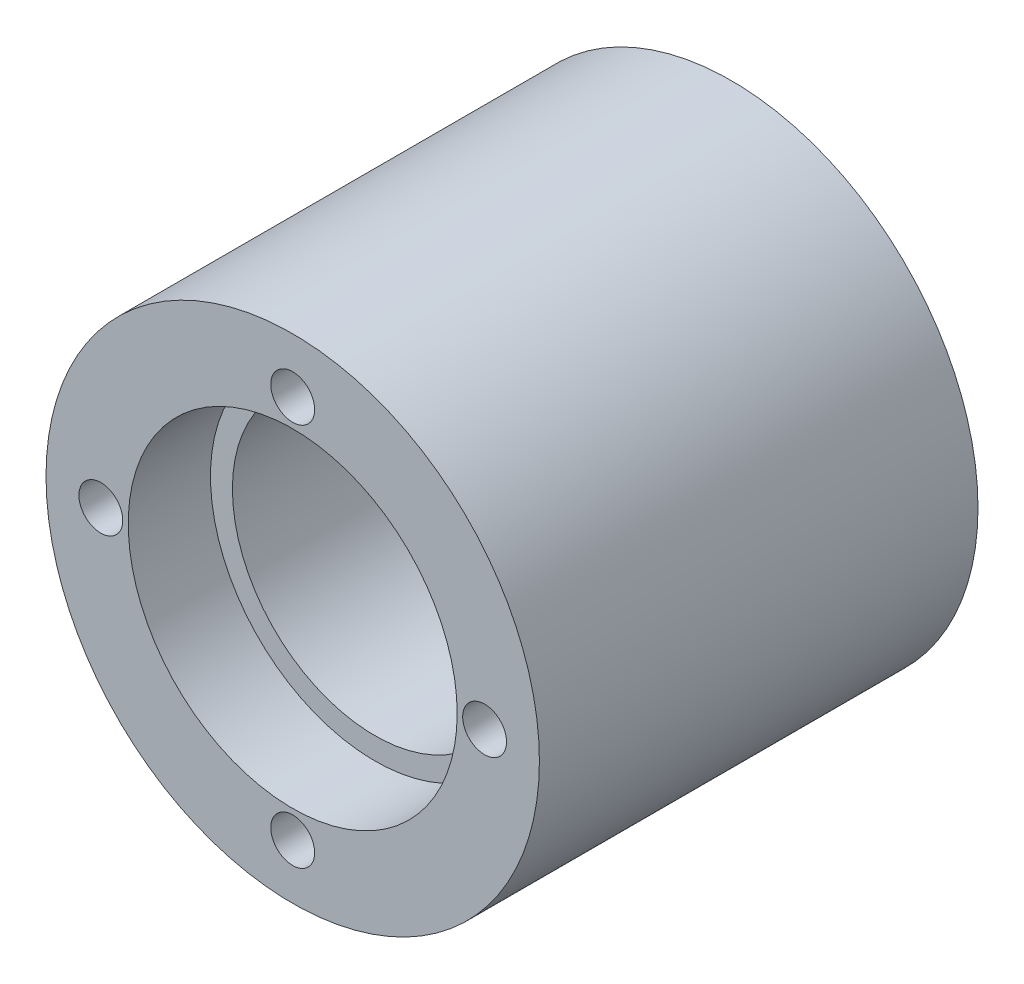
ISO-10303-21;
HEADER;
FILE_DESCRIPTION(('STEP AP214'),'2;1');
FILE_NAME('part.step','',(''),(''),'','','');
FILE_SCHEMA(('AUTOMOTIVE_DESIGN { 1 0 10303 214 1 1 1 1 }'));
ENDSEC;
DATA;
#1=APPLICATION_CONTEXT('core data for automotive mechanical design processes');
#2=APPLICATION_PROTOCOL_DEFINITION('international standard','automotive_design',2000,#1);
#3=PRODUCT_CONTEXT('',#1,'mechanical');
#4=PRODUCT('Part','Part','',(#3));
#5=PRODUCT_RELATED_PRODUCT_CATEGORY('part','',(#4));
#6=PRODUCT_DEFINITION_FORMATION('','',#4);
#7=PRODUCT_DEFINITION_CONTEXT('part definition',#1,'design');
#8=PRODUCT_DEFINITION('design','',#6,#7);
#9=PRODUCT_DEFINITION_SHAPE('','',#8);
#10=(LENGTH_UNIT() NAMED_UNIT(*) SI_UNIT(.MILLI.,.METRE.));
#11=(NAMED_UNIT(*) PLANE_ANGLE_UNIT() SI_UNIT($,.RADIAN.));
#12=(NAMED_UNIT(*) SI_UNIT($,.STERADIAN.) SOLID_ANGLE_UNIT());
#13=UNCERTAINTY_MEASURE_WITH_UNIT(LENGTH_MEASURE(1.E-05),#10,'distance_accuracy_value','');
#14=(GEOMETRIC_REPRESENTATION_CONTEXT(3) GLOBAL_UNCERTAINTY_ASSIGNED_CONTEXT((#13)) GLOBAL_UNIT_ASSIGNED_CONTEXT((#10,
#11,#12)) REPRESENTATION_CONTEXT('',''));
#15=CARTESIAN_POINT('',(0.,0.,0.));
#16=DIRECTION('',(0.,0.,1.));
#17=DIRECTION('',(1.,0.,0.));
#18=AXIS2_PLACEMENT_3D('',#15,#16,#17);
#19=CARTESIAN_POINT('',(0.,0.,20.));
#20=DIRECTION('',(0.,0.,-1.));
#21=DIRECTION('',(-1.,0.,0.));
#22=AXIS2_PLACEMENT_3D('',#19,#20,#21);
#23=CYLINDRICAL_SURFACE('',#22,15.);
#24=CARTESIAN_POINT('',(0.,0.,-20.));
#25=DIRECTION('',(0.,0.,1.));
#26=DIRECTION('',(1.,0.,0.));
#27=AXIS2_PLACEMENT_3D('',#24,#25,#26);
#28=CIRCLE('',#27,15.);
#29=CARTESIAN_POINT('',(15.,0.,-20.));
#30=VERTEX_POINT('',#29);
#31=EDGE_CURVE('E63',#30,#30,#28,.T.);
#32=ORIENTED_EDGE('',*,*,#31,.F.);
#33=EDGE_LOOP('',(#32));
#34=FACE_BOUND('',#33,.T.);
#35=CARTESIAN_POINT('',(0.,0.,-12.5));
#36=DIRECTION('',(0.,0.,1.));
#37=DIRECTION('',(1.,0.,0.));
#38=AXIS2_PLACEMENT_3D('',#35,#36,#37);
#39=CIRCLE('',#38,15.);
#40=CARTESIAN_POINT('',(15.,0.,-12.5));
#41=VERTEX_POINT('',#40);
#42=EDGE_CURVE('E99',#41,#41,#39,.T.);
#43=ORIENTED_EDGE('',*,*,#42,.T.);
#44=EDGE_LOOP('',(#43));
#45=FACE_BOUND('',#44,.T.);
#46=ADVANCED_FACE('F42',(#34,#45),#23,.F.);
#47=CARTESIAN_POINT('',(0.,0.,20.));
#48=DIRECTION('',(0.,0.,1.));
#49=DIRECTION('',(1.,0.,0.));
#50=AXIS2_PLACEMENT_3D('',#47,#48,#49);
#51=PLANE('',#50);
#52=CARTESIAN_POINT('',(0.,-17.5,20.));
#53=DIRECTION('',(0.,0.,1.));
#54=DIRECTION('',(1.,0.,0.));
#55=AXIS2_PLACEMENT_3D('',#52,#53,#54);
#56=CIRCLE('',#55,2.);
#57=CARTESIAN_POINT('',(2.,-17.5,20.));
#58=VERTEX_POINT('',#57);
#59=EDGE_CURVE('E83',#58,#58,#56,.T.);
#60=ORIENTED_EDGE('',*,*,#59,.F.);
#61=EDGE_LOOP('',(#60));
#62=FACE_BOUND('',#61,.T.);
#63=CARTESIAN_POINT('',(0.,17.5,20.));
#64=DIRECTION('',(0.,0.,1.));
#65=DIRECTION('',(1.,0.,0.));
#66=AXIS2_PLACEMENT_3D('',#63,#64,#65);
#67=CIRCLE('',#66,2.);
#68=CARTESIAN_POINT('',(2.,17.5,20.));
#69=VERTEX_POINT('',#68);
#70=EDGE_CURVE('E67',#69,#69,#67,.T.);
#71=ORIENTED_EDGE('',*,*,#70,.F.);
#72=EDGE_LOOP('',(#71));
#73=FACE_BOUND('',#72,.T.);
#74=CARTESIAN_POINT('',(0.,0.,20.));
#75=DIRECTION('',(0.,0.,1.));
#76=DIRECTION('',(1.,0.,0.));
#77=AXIS2_PLACEMENT_3D('',#74,#75,#76);
#78=CIRCLE('',#77,22.5);
#79=CARTESIAN_POINT('',(22.5,0.,20.));
#80=VERTEX_POINT('',#79);
#81=EDGE_CURVE('E50',#80,#80,#78,.T.);
#82=ORIENTED_EDGE('',*,*,#81,.T.);
#83=EDGE_LOOP('',(#82));
#84=FACE_BOUND('',#83,.T.);
#85=CARTESIAN_POINT('',(0.,0.,20.));
#86=DIRECTION('',(0.,0.,1.));
#87=DIRECTION('',(1.,0.,0.));
#88=AXIS2_PLACEMENT_3D('',#85,#86,#87);
#89=CIRCLE('',#88,15.);
#90=CARTESIAN_POINT('',(15.,0.,20.));
#91=VERTEX_POINT('',#90);
#92=EDGE_CURVE('E61',#91,#91,#89,.T.);
#93=ORIENTED_EDGE('',*,*,#92,.F.);
#94=EDGE_LOOP('',(#93));
#95=FACE_BOUND('',#94,.T.);
#96=CARTESIAN_POINT('',(17.5,0.,20.));
#97=DIRECTION('',(0.,0.,1.));
#98=DIRECTION('',(1.,0.,0.));
#99=AXIS2_PLACEMENT_3D('',#96,#97,#98);
#100=CIRCLE('',#99,2.);
#101=CARTESIAN_POINT('',(19.5,0.,20.));
#102=VERTEX_POINT('',#101);
#103=EDGE_CURVE('E75',#102,#102,#100,.T.);
#104=ORIENTED_EDGE('',*,*,#103,.F.);
#105=EDGE_LOOP('',(#104));
#106=FACE_BOUND('',#105,.T.);
#107=CARTESIAN_POINT('',(-17.5,0.,20.));
#108=DIRECTION('',(0.,0.,1.));
#109=DIRECTION('',(1.,0.,0.));
#110=AXIS2_PLACEMENT_3D('',#107,#108,#109);
#111=CIRCLE('',#110,2.);
#112=CARTESIAN_POINT('',(-15.5,0.,20.));
#113=VERTEX_POINT('',#112);
#114=EDGE_CURVE('E91',#113,#113,#111,.T.);
#115=ORIENTED_EDGE('',*,*,#114,.F.);
#116=EDGE_LOOP('',(#115));
#117=FACE_BOUND('',#116,.T.);
#118=ADVANCED_FACE('F134',(#62,#73,#84,#95,#106,#117),#51,.T.);
#119=CARTESIAN_POINT('',(0.,0.,-20.));
#120=DIRECTION('',(0.,0.,1.));
#121=DIRECTION('',(1.,0.,0.));
#122=AXIS2_PLACEMENT_3D('',#119,#120,#121);
#123=PLANE('',#122);
#124=CARTESIAN_POINT('',(0.,0.,-20.));
#125=DIRECTION('',(0.,0.,1.));
#126=DIRECTION('',(1.,0.,0.));
#127=AXIS2_PLACEMENT_3D('',#124,#125,#126);
#128=CIRCLE('',#127,22.5);
#129=CARTESIAN_POINT('',(22.5,0.,-20.));
#130=VERTEX_POINT('',#129);
#131=EDGE_CURVE('E55',#130,#130,#128,.T.);
#132=ORIENTED_EDGE('',*,*,#131,.F.);
#133=EDGE_LOOP('',(#132));
#134=FACE_BOUND('',#133,.T.);
#135=ORIENTED_EDGE('',*,*,#31,.T.);
#136=EDGE_LOOP('',(#135));
#137=FACE_BOUND('',#136,.T.);
#138=CARTESIAN_POINT('',(0.,17.5,-20.));
#139=DIRECTION('',(0.,0.,1.));
#140=DIRECTION('',(1.,0.,0.));
#141=AXIS2_PLACEMENT_3D('',#138,#139,#140);
#142=CIRCLE('',#141,2.);
#143=CARTESIAN_POINT('',(2.,17.5,-20.));
#144=VERTEX_POINT('',#143);
#145=EDGE_CURVE('E71',#144,#144,#142,.T.);
#146=ORIENTED_EDGE('',*,*,#145,.T.);
#147=EDGE_LOOP('',(#146));
#148=FACE_BOUND('',#147,.T.);
#149=CARTESIAN_POINT('',(17.5,0.,-20.));
#150=DIRECTION('',(0.,0.,1.));
#151=DIRECTION('',(1.,0.,0.));
#152=AXIS2_PLACEMENT_3D('',#149,#150,#151);
#153=CIRCLE('',#152,2.);
#154=CARTESIAN_POINT('',(19.5,0.,-20.));
#155=VERTEX_POINT('',#154);
#156=EDGE_CURVE('E79',#155,#155,#153,.T.);
#157=ORIENTED_EDGE('',*,*,#156,.T.);
#158=EDGE_LOOP('',(#157));
#159=FACE_BOUND('',#158,.T.);
#160=CARTESIAN_POINT('',(0.,-17.5,-20.));
#161=DIRECTION('',(0.,0.,1.));
#162=DIRECTION('',(1.,0.,0.));
#163=AXIS2_PLACEMENT_3D('',#160,#161,#162);
#164=CIRCLE('',#163,2.);
#165=CARTESIAN_POINT('',(2.,-17.5,-20.));
#166=VERTEX_POINT('',#165);
#167=EDGE_CURVE('E87',#166,#166,#164,.T.);
#168=ORIENTED_EDGE('',*,*,#167,.T.);
#169=EDGE_LOOP('',(#168));
#170=FACE_BOUND('',#169,.T.);
#171=CARTESIAN_POINT('',(-17.5,0.,-20.));
#172=DIRECTION('',(0.,0.,1.));
#173=DIRECTION('',(1.,0.,0.));
#174=AXIS2_PLACEMENT_3D('',#171,#172,#173);
#175=CIRCLE('',#174,2.);
#176=CARTESIAN_POINT('',(-15.5,0.,-20.));
#177=VERTEX_POINT('',#176);
#178=EDGE_CURVE('E95',#177,#177,#175,.T.);
#179=ORIENTED_EDGE('',*,*,#178,.T.);
#180=EDGE_LOOP('',(#179));
#181=FACE_BOUND('',#180,.T.);
#182=ADVANCED_FACE('F141',(#134,#137,#148,#159,#170,#181),#123,.F.);
#183=CARTESIAN_POINT('',(0.,0.,20.));
#184=DIRECTION('',(0.,0.,-1.));
#185=DIRECTION('',(-1.,0.,0.));
#186=AXIS2_PLACEMENT_3D('',#183,#184,#185);
#187=CYLINDRICAL_SURFACE('',#186,22.5);
#188=ORIENTED_EDGE('',*,*,#81,.F.);
#189=EDGE_LOOP('',(#188));
#190=FACE_BOUND('',#189,.T.);
#191=ORIENTED_EDGE('',*,*,#131,.T.);
#192=EDGE_LOOP('',(#191));
#193=FACE_BOUND('',#192,.T.);
#194=ADVANCED_FACE('F44',(#190,#193),#187,.T.);
#195=CARTESIAN_POINT('',(0.,0.,12.5));
#196=DIRECTION('',(0.,0.,1.));
#197=DIRECTION('',(1.,0.,0.));
#198=AXIS2_PLACEMENT_3D('',#195,#196,#197);
#199=CIRCLE('',#198,15.);
#200=CARTESIAN_POINT('',(15.,0.,12.5));
#201=VERTEX_POINT('',#200);
#202=EDGE_CURVE('E10',#201,#201,#199,.T.);
#203=ORIENTED_EDGE('',*,*,#202,.F.);
#204=EDGE_LOOP('',(#203));
#205=FACE_BOUND('',#204,.T.);
#206=ORIENTED_EDGE('',*,*,#92,.T.);
#207=EDGE_LOOP('',(#206));
#208=FACE_BOUND('',#207,.T.);
#209=ADVANCED_FACE('F137',(#205,#208),#23,.F.);
#210=CARTESIAN_POINT('',(0.,17.5,20.));
#211=DIRECTION('',(0.,0.,-1.));
#212=DIRECTION('',(-1.,0.,0.));
#213=AXIS2_PLACEMENT_3D('',#210,#211,#212);
#214=CYLINDRICAL_SURFACE('',#213,2.);
#215=ORIENTED_EDGE('',*,*,#70,.T.);
#216=EDGE_LOOP('',(#215));
#217=FACE_BOUND('',#216,.T.);
#218=ORIENTED_EDGE('',*,*,#145,.F.);
#219=EDGE_LOOP('',(#218));
#220=FACE_BOUND('',#219,.T.);
#221=ADVANCED_FACE('F148',(#217,#220),#214,.F.);
#222=CARTESIAN_POINT('',(17.5,0.,20.));
#223=DIRECTION('',(0.,0.,-1.));
#224=DIRECTION('',(-1.,0.,0.));
#225=AXIS2_PLACEMENT_3D('',#222,#223,#224);
#226=CYLINDRICAL_SURFACE('',#225,2.);
#227=ORIENTED_EDGE('',*,*,#103,.T.);
#228=EDGE_LOOP('',(#227));
#229=FACE_BOUND('',#228,.T.);
#230=ORIENTED_EDGE('',*,*,#156,.F.);
#231=EDGE_LOOP('',(#230));
#232=FACE_BOUND('',#231,.T.);
#233=ADVANCED_FACE('F154',(#229,#232),#226,.F.);
#234=CARTESIAN_POINT('',(0.,-17.5,20.));
#235=DIRECTION('',(0.,0.,-1.));
#236=DIRECTION('',(-1.,0.,0.));
#237=AXIS2_PLACEMENT_3D('',#234,#235,#236);
#238=CYLINDRICAL_SURFACE('',#237,2.);
#239=ORIENTED_EDGE('',*,*,#59,.T.);
#240=EDGE_LOOP('',(#239));
#241=FACE_BOUND('',#240,.T.);
#242=ORIENTED_EDGE('',*,*,#167,.F.);
#243=EDGE_LOOP('',(#242));
#244=FACE_BOUND('',#243,.T.);
#245=ADVANCED_FACE('F129',(#241,#244),#238,.F.);
#246=CARTESIAN_POINT('',(-17.5,0.,20.));
#247=DIRECTION('',(0.,0.,-1.));
#248=DIRECTION('',(-1.,0.,0.));
#249=AXIS2_PLACEMENT_3D('',#246,#247,#248);
#250=CYLINDRICAL_SURFACE('',#249,2.);
#251=ORIENTED_EDGE('',*,*,#114,.T.);
#252=EDGE_LOOP('',(#251));
#253=FACE_BOUND('',#252,.T.);
#254=ORIENTED_EDGE('',*,*,#178,.F.);
#255=EDGE_LOOP('',(#254));
#256=FACE_BOUND('',#255,.T.);
#257=ADVANCED_FACE('F121',(#253,#256),#250,.F.);
#258=CARTESIAN_POINT('',(0.,0.,12.5));
#259=DIRECTION('',(0.,0.,1.));
#260=DIRECTION('',(1.,0.,0.));
#261=AXIS2_PLACEMENT_3D('',#258,#259,#260);
#262=PLANE('',#261);
#263=ORIENTED_EDGE('',*,*,#202,.T.);
#264=EDGE_LOOP('',(#263));
#265=FACE_BOUND('',#264,.T.);
#266=CARTESIAN_POINT('',(0.,0.,12.5));
#267=DIRECTION('',(0.,0.,1.));
#268=DIRECTION('',(1.,0.,0.));
#269=AXIS2_PLACEMENT_3D('',#266,#267,#268);
#270=CIRCLE('',#269,13.);
#271=CARTESIAN_POINT('',(13.,0.,12.5));
#272=VERTEX_POINT('',#271);
#273=EDGE_CURVE('E106',#272,#272,#270,.T.);
#274=ORIENTED_EDGE('',*,*,#273,.F.);
#275=EDGE_LOOP('',(#274));
#276=FACE_BOUND('',#275,.T.);
#277=ADVANCED_FACE('F118',(#265,#276),#262,.T.);
#278=CARTESIAN_POINT('',(0.,0.,-12.5));
#279=DIRECTION('',(0.,0.,1.));
#280=DIRECTION('',(1.,0.,0.));
#281=AXIS2_PLACEMENT_3D('',#278,#279,#280);
#282=PLANE('',#281);
#283=ORIENTED_EDGE('',*,*,#42,.F.);
#284=EDGE_LOOP('',(#283));
#285=FACE_BOUND('',#284,.T.);
#286=CARTESIAN_POINT('',(0.,0.,-12.5));
#287=DIRECTION('',(0.,0.,1.));
#288=DIRECTION('',(1.,0.,0.));
#289=AXIS2_PLACEMENT_3D('',#286,#287,#288);
#290=CIRCLE('',#289,13.);
#291=CARTESIAN_POINT('',(13.,0.,-12.5));
#292=VERTEX_POINT('',#291);
#293=EDGE_CURVE('E107',#292,#292,#290,.T.);
#294=ORIENTED_EDGE('',*,*,#293,.T.);
#295=EDGE_LOOP('',(#294));
#296=FACE_BOUND('',#295,.T.);
#297=ADVANCED_FACE('F120',(#285,#296),#282,.F.);
#298=CARTESIAN_POINT('',(0.,0.,12.5));
#299=DIRECTION('',(0.,0.,-1.));
#300=DIRECTION('',(-1.,0.,0.));
#301=AXIS2_PLACEMENT_3D('',#298,#299,#300);
#302=CYLINDRICAL_SURFACE('',#301,13.);
#303=ORIENTED_EDGE('',*,*,#273,.T.);
#304=EDGE_LOOP('',(#303));
#305=FACE_BOUND('',#304,.T.);
#306=ORIENTED_EDGE('',*,*,#293,.F.);
#307=EDGE_LOOP('',(#306));
#308=FACE_BOUND('',#307,.T.);
#309=ADVANCED_FACE('F115',(#305,#308),#302,.F.);
#310=CLOSED_SHELL('',(#46,#118,#182,#194,#209,#221,#233,#245,#257,#277,#297,#309));
#311=MANIFOLD_SOLID_BREP('B2',#310);
#312=ADVANCED_BREP_SHAPE_REPRESENTATION('',(#18,#311),#14);
#313=SHAPE_DEFINITION_REPRESENTATION(#9,#312);
ENDSEC;
END-ISO-10303-21;
